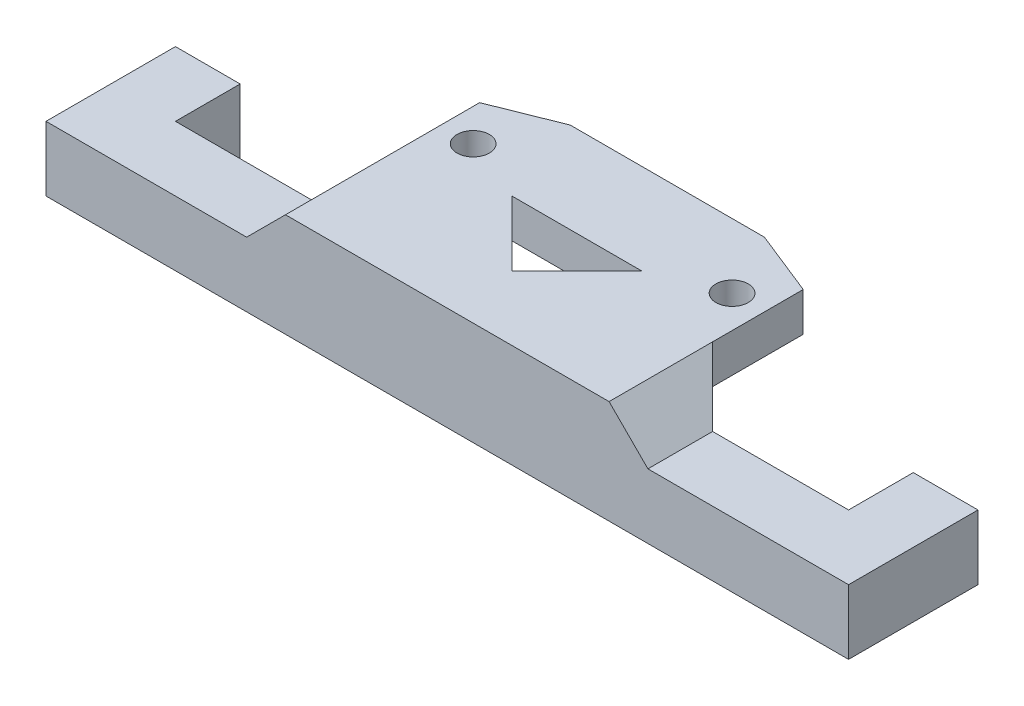
ISO-10303-21;
HEADER;
FILE_DESCRIPTION(('STEP AP214'),'2;1');
FILE_NAME('part.step','',(''),(''),'','','');
FILE_SCHEMA(('AUTOMOTIVE_DESIGN { 1 0 10303 214 1 1 1 1 }'));
ENDSEC;
DATA;
#1=APPLICATION_CONTEXT('core data for automotive mechanical design processes');
#2=APPLICATION_PROTOCOL_DEFINITION('international standard','automotive_design',2000,#1);
#3=PRODUCT_CONTEXT('',#1,'mechanical');
#4=PRODUCT('Part','Part','',(#3));
#5=PRODUCT_RELATED_PRODUCT_CATEGORY('part','',(#4));
#6=PRODUCT_DEFINITION_FORMATION('','',#4);
#7=PRODUCT_DEFINITION_CONTEXT('part definition',#1,'design');
#8=PRODUCT_DEFINITION('design','',#6,#7);
#9=PRODUCT_DEFINITION_SHAPE('','',#8);
#10=(LENGTH_UNIT() NAMED_UNIT(*) SI_UNIT(.MILLI.,.METRE.));
#11=(NAMED_UNIT(*) PLANE_ANGLE_UNIT() SI_UNIT($,.RADIAN.));
#12=(NAMED_UNIT(*) SI_UNIT($,.STERADIAN.) SOLID_ANGLE_UNIT());
#13=UNCERTAINTY_MEASURE_WITH_UNIT(LENGTH_MEASURE(1.E-05),#10,'distance_accuracy_value','');
#14=(GEOMETRIC_REPRESENTATION_CONTEXT(3) GLOBAL_UNCERTAINTY_ASSIGNED_CONTEXT((#13)) GLOBAL_UNIT_ASSIGNED_CONTEXT((#10,
#11,#12)) REPRESENTATION_CONTEXT('',''));
#15=CARTESIAN_POINT('',(0.,0.,0.));
#16=DIRECTION('',(0.,0.,1.));
#17=DIRECTION('',(1.,0.,0.));
#18=AXIS2_PLACEMENT_3D('',#15,#16,#17);
#19=CARTESIAN_POINT('',(0.,5.,0.));
#20=DIRECTION('',(0.,-1.,0.));
#21=DIRECTION('',(0.,0.,-1.));
#22=AXIS2_PLACEMENT_3D('',#19,#20,#21);
#23=PLANE('',#22);
#24=DIRECTION('',(1.,0.,0.));
#25=VECTOR('',#24,1.);
#26=CARTESIAN_POINT('',(32.8888888888889,5.,5.));
#27=LINE('',#26,#25);
#28=CARTESIAN_POINT('',(-29.1111111111111,5.,5.00000000000001));
#29=VERTEX_POINT('',#28);
#30=CARTESIAN_POINT('',(-13.6111111111112,5.,5.00000000000001));
#31=VERTEX_POINT('',#30);
#32=EDGE_CURVE('E217',#29,#31,#27,.T.);
#33=ORIENTED_EDGE('',*,*,#32,.T.);
#34=DIRECTION('',(0.,0.,-1.));
#35=VECTOR('',#34,1.);
#36=CARTESIAN_POINT('',(-13.6111111111112,5.,0.));
#37=LINE('',#36,#35);
#38=CARTESIAN_POINT('',(-13.6111111111112,5.,0.));
#39=VERTEX_POINT('',#38);
#40=EDGE_CURVE('E301',#31,#39,#37,.T.);
#41=ORIENTED_EDGE('',*,*,#40,.T.);
#42=DIRECTION('',(-1.,0.,0.));
#43=VECTOR('',#42,1.);
#44=CARTESIAN_POINT('',(-24.1111111111111,5.,0.));
#45=LINE('',#44,#43);
#46=CARTESIAN_POINT('',(-24.1111111111111,5.,0.));
#47=VERTEX_POINT('',#46);
#48=EDGE_CURVE('E268',#39,#47,#45,.T.);
#49=ORIENTED_EDGE('',*,*,#48,.T.);
#50=DIRECTION('',(0.,0.,-1.));
#51=VECTOR('',#50,1.);
#52=CARTESIAN_POINT('',(-24.1111111111111,5.,-5.));
#53=LINE('',#52,#51);
#54=CARTESIAN_POINT('',(-24.1111111111111,5.,-5.));
#55=VERTEX_POINT('',#54);
#56=EDGE_CURVE('E245',#47,#55,#53,.T.);
#57=ORIENTED_EDGE('',*,*,#56,.T.);
#58=DIRECTION('',(-1.,0.,0.));
#59=VECTOR('',#58,1.);
#60=CARTESIAN_POINT('',(-29.1111111111111,5.,-5.));
#61=LINE('',#60,#59);
#62=CARTESIAN_POINT('',(-29.1111111111111,5.,-5.));
#63=VERTEX_POINT('',#62);
#64=EDGE_CURVE('E202',#55,#63,#61,.T.);
#65=ORIENTED_EDGE('',*,*,#64,.T.);
#66=DIRECTION('',(0.,0.,1.));
#67=VECTOR('',#66,1.);
#68=CARTESIAN_POINT('',(-29.1111111111111,5.,5.00000000000001));
#69=LINE('',#68,#67);
#70=EDGE_CURVE('E205',#63,#29,#69,.T.);
#71=ORIENTED_EDGE('',*,*,#70,.T.);
#72=EDGE_LOOP('',(#33,#41,#49,#57,#65,#71));
#73=FACE_BOUND('',#72,.T.);
#74=ADVANCED_FACE('F35',(#73),#23,.F.);
#75=CARTESIAN_POINT('',(-29.1111111111111,5.,-5.));
#76=DIRECTION('',(0.,0.,1.));
#77=DIRECTION('',(1.,0.,0.));
#78=AXIS2_PLACEMENT_3D('',#75,#76,#77);
#79=PLANE('',#78);
#80=DIRECTION('',(-1.,0.,0.));
#81=VECTOR('',#80,1.);
#82=CARTESIAN_POINT('',(-29.1111111111111,0.,-5.));
#83=LINE('',#82,#81);
#84=CARTESIAN_POINT('',(-24.1111111111111,0.,-5.));
#85=VERTEX_POINT('',#84);
#86=CARTESIAN_POINT('',(-29.1111111111111,0.,-5.));
#87=VERTEX_POINT('',#86);
#88=EDGE_CURVE('E259',#85,#87,#83,.T.);
#89=ORIENTED_EDGE('',*,*,#88,.T.);
#90=DIRECTION('',(0.,-1.,0.));
#91=VECTOR('',#90,1.);
#92=CARTESIAN_POINT('',(-29.1111111111111,5.,-5.));
#93=LINE('',#92,#91);
#94=EDGE_CURVE('E220',#63,#87,#93,.T.);
#95=ORIENTED_EDGE('',*,*,#94,.F.);
#96=ORIENTED_EDGE('',*,*,#64,.F.);
#97=DIRECTION('',(0.,-1.,0.));
#98=VECTOR('',#97,1.);
#99=CARTESIAN_POINT('',(-24.1111111111111,5.,-5.));
#100=LINE('',#99,#98);
#101=EDGE_CURVE('E242',#55,#85,#100,.T.);
#102=ORIENTED_EDGE('',*,*,#101,.T.);
#103=EDGE_LOOP('',(#89,#95,#96,#102));
#104=FACE_BOUND('',#103,.T.);
#105=ADVANCED_FACE('F440',(#104),#79,.F.);
#106=CARTESIAN_POINT('',(-29.1111111111111,5.,5.00000000000001));
#107=DIRECTION('',(1.,0.,0.));
#108=DIRECTION('',(0.,0.,-1.));
#109=AXIS2_PLACEMENT_3D('',#106,#107,#108);
#110=PLANE('',#109);
#111=DIRECTION('',(0.,0.,1.));
#112=VECTOR('',#111,1.);
#113=CARTESIAN_POINT('',(-29.1111111111111,0.,5.00000000000001));
#114=LINE('',#113,#112);
#115=CARTESIAN_POINT('',(-29.1111111111111,0.,5.00000000000001));
#116=VERTEX_POINT('',#115);
#117=EDGE_CURVE('E257',#87,#116,#114,.T.);
#118=ORIENTED_EDGE('',*,*,#117,.T.);
#119=DIRECTION('',(0.,-1.,0.));
#120=VECTOR('',#119,1.);
#121=CARTESIAN_POINT('',(-29.1111111111111,5.,5.00000000000001));
#122=LINE('',#121,#120);
#123=EDGE_CURVE('E224',#29,#116,#122,.T.);
#124=ORIENTED_EDGE('',*,*,#123,.F.);
#125=ORIENTED_EDGE('',*,*,#70,.F.);
#126=ORIENTED_EDGE('',*,*,#94,.T.);
#127=EDGE_LOOP('',(#118,#124,#125,#126));
#128=FACE_BOUND('',#127,.T.);
#129=ADVANCED_FACE('F445',(#128),#110,.F.);
#130=CARTESIAN_POINT('',(32.8888888888889,5.,5.));
#131=DIRECTION('',(0.,0.,-1.));
#132=DIRECTION('',(-1.,0.,0.));
#133=AXIS2_PLACEMENT_3D('',#130,#131,#132);
#134=PLANE('',#133);
#135=DIRECTION('',(1.,0.,0.));
#136=VECTOR('',#135,1.);
#137=CARTESIAN_POINT('',(32.8888888888889,0.,5.));
#138=LINE('',#137,#136);
#139=CARTESIAN_POINT('',(32.8888888888889,0.,5.));
#140=VERTEX_POINT('',#139);
#141=EDGE_CURVE('E255',#116,#140,#138,.T.);
#142=ORIENTED_EDGE('',*,*,#141,.T.);
#143=DIRECTION('',(0.,-1.,0.));
#144=VECTOR('',#143,1.);
#145=CARTESIAN_POINT('',(32.8888888888889,5.,5.));
#146=LINE('',#145,#144);
#147=CARTESIAN_POINT('',(32.8888888888889,5.,5.));
#148=VERTEX_POINT('',#147);
#149=EDGE_CURVE('E227',#148,#140,#146,.T.);
#150=ORIENTED_EDGE('',*,*,#149,.F.);
#151=CARTESIAN_POINT('',(17.3888888888889,5.,5.));
#152=VERTEX_POINT('',#151);
#153=EDGE_CURVE('E208',#152,#148,#27,.T.);
#154=ORIENTED_EDGE('',*,*,#153,.F.);
#155=DIRECTION('',(-0.707106781186552,0.707106781186544,0.));
#156=VECTOR('',#155,1.);
#157=CARTESIAN_POINT('',(25.138888888889,-2.74999999999998,5.));
#158=LINE('',#157,#156);
#159=CARTESIAN_POINT('',(14.3888888888889,8.,5.));
#160=VERTEX_POINT('',#159);
#161=EDGE_CURVE('E300',#152,#160,#158,.T.);
#162=ORIENTED_EDGE('',*,*,#161,.T.);
#163=DIRECTION('',(1.,0.,0.));
#164=VECTOR('',#163,1.);
#165=CARTESIAN_POINT('',(0.,8.,5.));
#166=LINE('',#165,#164);
#167=CARTESIAN_POINT('',(-10.6111111111111,8.,5.));
#168=VERTEX_POINT('',#167);
#169=EDGE_CURVE('E399',#168,#160,#166,.T.);
#170=ORIENTED_EDGE('',*,*,#169,.F.);
#171=DIRECTION('',(-0.707106781186552,-0.707106781186544,0.));
#172=VECTOR('',#171,1.);
#173=CARTESIAN_POINT('',(9.63888888888911,28.25,5.));
#174=LINE('',#173,#172);
#175=EDGE_CURVE('E316',#168,#31,#174,.T.);
#176=ORIENTED_EDGE('',*,*,#175,.T.);
#177=ORIENTED_EDGE('',*,*,#32,.F.);
#178=ORIENTED_EDGE('',*,*,#123,.T.);
#179=EDGE_LOOP('',(#142,#150,#154,#162,#170,#176,#177,#178));
#180=FACE_BOUND('',#179,.T.);
#181=ADVANCED_FACE('F467',(#180),#134,.F.);
#182=CARTESIAN_POINT('',(32.8888888888889,5.,-5.));
#183=DIRECTION('',(-1.,0.,0.));
#184=DIRECTION('',(0.,0.,1.));
#185=AXIS2_PLACEMENT_3D('',#182,#183,#184);
#186=PLANE('',#185);
#187=DIRECTION('',(0.,0.,-1.));
#188=VECTOR('',#187,1.);
#189=CARTESIAN_POINT('',(32.8888888888889,0.,-5.));
#190=LINE('',#189,#188);
#191=CARTESIAN_POINT('',(32.8888888888889,0.,-5.));
#192=VERTEX_POINT('',#191);
#193=EDGE_CURVE('E253',#140,#192,#190,.T.);
#194=ORIENTED_EDGE('',*,*,#193,.T.);
#195=DIRECTION('',(0.,-1.,0.));
#196=VECTOR('',#195,1.);
#197=CARTESIAN_POINT('',(32.8888888888889,5.,-5.));
#198=LINE('',#197,#196);
#199=CARTESIAN_POINT('',(32.8888888888889,5.,-5.));
#200=VERTEX_POINT('',#199);
#201=EDGE_CURVE('E230',#200,#192,#198,.T.);
#202=ORIENTED_EDGE('',*,*,#201,.F.);
#203=DIRECTION('',(0.,0.,-1.));
#204=VECTOR('',#203,1.);
#205=CARTESIAN_POINT('',(32.8888888888889,5.,-5.));
#206=LINE('',#205,#204);
#207=EDGE_CURVE('E211',#148,#200,#206,.T.);
#208=ORIENTED_EDGE('',*,*,#207,.F.);
#209=ORIENTED_EDGE('',*,*,#149,.T.);
#210=EDGE_LOOP('',(#194,#202,#208,#209));
#211=FACE_BOUND('',#210,.T.);
#212=ADVANCED_FACE('F281',(#211),#186,.F.);
#213=CARTESIAN_POINT('',(27.8888888888889,5.,-5.));
#214=DIRECTION('',(0.,0.,1.));
#215=DIRECTION('',(1.,0.,0.));
#216=AXIS2_PLACEMENT_3D('',#213,#214,#215);
#217=PLANE('',#216);
#218=DIRECTION('',(-1.,0.,0.));
#219=VECTOR('',#218,1.);
#220=CARTESIAN_POINT('',(27.8888888888889,0.,-5.));
#221=LINE('',#220,#219);
#222=CARTESIAN_POINT('',(27.8888888888889,0.,-5.));
#223=VERTEX_POINT('',#222);
#224=EDGE_CURVE('E251',#192,#223,#221,.T.);
#225=ORIENTED_EDGE('',*,*,#224,.T.);
#226=DIRECTION('',(0.,-1.,0.));
#227=VECTOR('',#226,1.);
#228=CARTESIAN_POINT('',(27.8888888888889,5.,-5.));
#229=LINE('',#228,#227);
#230=CARTESIAN_POINT('',(27.8888888888889,5.,-5.));
#231=VERTEX_POINT('',#230);
#232=EDGE_CURVE('E233',#231,#223,#229,.T.);
#233=ORIENTED_EDGE('',*,*,#232,.F.);
#234=DIRECTION('',(-1.,0.,0.));
#235=VECTOR('',#234,1.);
#236=CARTESIAN_POINT('',(27.8888888888889,5.,-5.));
#237=LINE('',#236,#235);
#238=EDGE_CURVE('E270',#200,#231,#237,.T.);
#239=ORIENTED_EDGE('',*,*,#238,.F.);
#240=ORIENTED_EDGE('',*,*,#201,.T.);
#241=EDGE_LOOP('',(#225,#233,#239,#240));
#242=FACE_BOUND('',#241,.T.);
#243=ADVANCED_FACE('F285',(#242),#217,.F.);
#244=CARTESIAN_POINT('',(27.8888888888889,5.,0.));
#245=DIRECTION('',(1.,0.,0.));
#246=DIRECTION('',(0.,0.,-1.));
#247=AXIS2_PLACEMENT_3D('',#244,#245,#246);
#248=PLANE('',#247);
#249=DIRECTION('',(0.,0.,1.));
#250=VECTOR('',#249,1.);
#251=CARTESIAN_POINT('',(27.8888888888889,0.,0.));
#252=LINE('',#251,#250);
#253=CARTESIAN_POINT('',(27.8888888888889,0.,0.));
#254=VERTEX_POINT('',#253);
#255=EDGE_CURVE('E249',#223,#254,#252,.T.);
#256=ORIENTED_EDGE('',*,*,#255,.T.);
#257=DIRECTION('',(0.,-1.,0.));
#258=VECTOR('',#257,1.);
#259=CARTESIAN_POINT('',(27.8888888888889,5.,0.));
#260=LINE('',#259,#258);
#261=CARTESIAN_POINT('',(27.8888888888889,5.,0.));
#262=VERTEX_POINT('',#261);
#263=EDGE_CURVE('E236',#262,#254,#260,.T.);
#264=ORIENTED_EDGE('',*,*,#263,.F.);
#265=DIRECTION('',(0.,0.,1.));
#266=VECTOR('',#265,1.);
#267=CARTESIAN_POINT('',(27.8888888888889,5.,0.));
#268=LINE('',#267,#266);
#269=EDGE_CURVE('E269',#231,#262,#268,.T.);
#270=ORIENTED_EDGE('',*,*,#269,.F.);
#271=ORIENTED_EDGE('',*,*,#232,.T.);
#272=EDGE_LOOP('',(#256,#264,#270,#271));
#273=FACE_BOUND('',#272,.T.);
#274=ADVANCED_FACE('F290',(#273),#248,.F.);
#275=CARTESIAN_POINT('',(-24.1111111111111,5.,0.));
#276=DIRECTION('',(0.,0.,1.));
#277=DIRECTION('',(1.,0.,0.));
#278=AXIS2_PLACEMENT_3D('',#275,#276,#277);
#279=PLANE('',#278);
#280=CARTESIAN_POINT('',(17.3888888888889,5.,0.));
#281=VERTEX_POINT('',#280);
#282=CARTESIAN_POINT('',(1.88888888888887,5.,0.));
#283=VERTEX_POINT('',#282);
#284=EDGE_CURVE('E267',#281,#283,#45,.T.);
#285=ORIENTED_EDGE('',*,*,#284,.F.);
#286=EDGE_CURVE('E264',#262,#281,#45,.T.);
#287=ORIENTED_EDGE('',*,*,#286,.F.);
#288=ORIENTED_EDGE('',*,*,#263,.T.);
#289=DIRECTION('',(-1.,0.,0.));
#290=VECTOR('',#289,1.);
#291=CARTESIAN_POINT('',(-24.1111111111111,0.,0.));
#292=LINE('',#291,#290);
#293=CARTESIAN_POINT('',(-24.1111111111111,0.,0.));
#294=VERTEX_POINT('',#293);
#295=EDGE_CURVE('E247',#254,#294,#292,.T.);
#296=ORIENTED_EDGE('',*,*,#295,.T.);
#297=DIRECTION('',(0.,-1.,0.));
#298=VECTOR('',#297,1.);
#299=CARTESIAN_POINT('',(-24.1111111111111,5.,0.));
#300=LINE('',#299,#298);
#301=EDGE_CURVE('E239',#47,#294,#300,.T.);
#302=ORIENTED_EDGE('',*,*,#301,.F.);
#303=ORIENTED_EDGE('',*,*,#48,.F.);
#304=EDGE_CURVE('E329',#283,#39,#45,.T.);
#305=ORIENTED_EDGE('',*,*,#304,.F.);
#306=EDGE_LOOP('',(#285,#287,#288,#296,#302,#303,#305));
#307=FACE_BOUND('',#306,.T.);
#308=ADVANCED_FACE('F328',(#307),#279,.F.);
#309=CARTESIAN_POINT('',(-24.1111111111111,5.,-5.));
#310=DIRECTION('',(-1.,0.,0.));
#311=DIRECTION('',(0.,0.,1.));
#312=AXIS2_PLACEMENT_3D('',#309,#310,#311);
#313=PLANE('',#312);
#314=DIRECTION('',(0.,0.,-1.));
#315=VECTOR('',#314,1.);
#316=CARTESIAN_POINT('',(-24.1111111111111,0.,-5.));
#317=LINE('',#316,#315);
#318=EDGE_CURVE('E206',#294,#85,#317,.T.);
#319=ORIENTED_EDGE('',*,*,#318,.T.);
#320=ORIENTED_EDGE('',*,*,#101,.F.);
#321=ORIENTED_EDGE('',*,*,#56,.F.);
#322=ORIENTED_EDGE('',*,*,#301,.T.);
#323=EDGE_LOOP('',(#319,#320,#321,#322));
#324=FACE_BOUND('',#323,.T.);
#325=ADVANCED_FACE('F450',(#324),#313,.F.);
#326=ORIENTED_EDGE('',*,*,#286,.T.);
#327=DIRECTION('',(0.,0.,1.));
#328=VECTOR('',#327,1.);
#329=CARTESIAN_POINT('',(17.3888888888889,5.,0.));
#330=LINE('',#329,#328);
#331=EDGE_CURVE('E223',#281,#152,#330,.T.);
#332=ORIENTED_EDGE('',*,*,#331,.T.);
#333=ORIENTED_EDGE('',*,*,#153,.T.);
#334=ORIENTED_EDGE('',*,*,#207,.T.);
#335=ORIENTED_EDGE('',*,*,#238,.T.);
#336=ORIENTED_EDGE('',*,*,#269,.T.);
#337=EDGE_LOOP('',(#326,#332,#333,#334,#335,#336));
#338=FACE_BOUND('',#337,.T.);
#339=ADVANCED_FACE('F276',(#338),#23,.F.);
#340=CARTESIAN_POINT('',(0.,0.,0.));
#341=DIRECTION('',(0.,-1.,0.));
#342=DIRECTION('',(0.,0.,-1.));
#343=AXIS2_PLACEMENT_3D('',#340,#341,#342);
#344=PLANE('',#343);
#345=ORIENTED_EDGE('',*,*,#88,.F.);
#346=ORIENTED_EDGE('',*,*,#318,.F.);
#347=ORIENTED_EDGE('',*,*,#295,.F.);
#348=ORIENTED_EDGE('',*,*,#255,.F.);
#349=ORIENTED_EDGE('',*,*,#224,.F.);
#350=ORIENTED_EDGE('',*,*,#193,.F.);
#351=ORIENTED_EDGE('',*,*,#141,.F.);
#352=ORIENTED_EDGE('',*,*,#117,.F.);
#353=EDGE_LOOP('',(#345,#346,#347,#348,#349,#350,#351,#352));
#354=FACE_BOUND('',#353,.T.);
#355=ADVANCED_FACE('F427',(#354),#344,.T.);
#356=CARTESIAN_POINT('',(0.,5.,0.));
#357=DIRECTION('',(0.,1.,0.));
#358=DIRECTION('',(0.,0.,1.));
#359=AXIS2_PLACEMENT_3D('',#356,#357,#358);
#360=PLANE('',#359);
#361=CARTESIAN_POINT('',(11.8888888888889,5.,-7.));
#362=DIRECTION('',(0.,1.,0.));
#363=DIRECTION('',(0.,0.,1.));
#364=AXIS2_PLACEMENT_3D('',#361,#362,#363);
#365=CIRCLE('',#364,1.25);
#366=CARTESIAN_POINT('',(11.8888888888889,5.,-5.75));
#367=VERTEX_POINT('',#366);
#368=EDGE_CURVE('E187',#367,#367,#365,.F.);
#369=ORIENTED_EDGE('',*,*,#368,.F.);
#370=EDGE_LOOP('',(#369));
#371=FACE_BOUND('',#370,.T.);
#372=CARTESIAN_POINT('',(-8.11111111111113,5.,-7.));
#373=DIRECTION('',(0.,1.,0.));
#374=DIRECTION('',(0.,0.,1.));
#375=AXIS2_PLACEMENT_3D('',#372,#373,#374);
#376=CIRCLE('',#375,1.25);
#377=CARTESIAN_POINT('',(-8.11111111111113,5.,-5.75));
#378=VERTEX_POINT('',#377);
#379=EDGE_CURVE('E346',#378,#378,#376,.T.);
#380=ORIENTED_EDGE('',*,*,#379,.T.);
#381=EDGE_LOOP('',(#380));
#382=FACE_BOUND('',#381,.T.);
#383=DIRECTION('',(0.,0.,1.));
#384=VECTOR('',#383,1.);
#385=CARTESIAN_POINT('',(14.3888888888889,5.,0.));
#386=LINE('',#385,#384);
#387=CARTESIAN_POINT('',(14.3888888888889,5.,-10.));
#388=VERTEX_POINT('',#387);
#389=CARTESIAN_POINT('',(14.3888888888889,5.,-3.00000000000005));
#390=VERTEX_POINT('',#389);
#391=EDGE_CURVE('E376',#388,#390,#386,.T.);
#392=ORIENTED_EDGE('',*,*,#391,.T.);
#393=DIRECTION('',(0.707106781186543,0.,0.707106781186552));
#394=VECTOR('',#393,1.);
#395=CARTESIAN_POINT('',(8.69444444444455,5.,-8.69444444444444));
#396=LINE('',#395,#394);
#397=EDGE_CURVE('E305',#390,#281,#396,.T.);
#398=ORIENTED_EDGE('',*,*,#397,.T.);
#399=ORIENTED_EDGE('',*,*,#284,.T.);
#400=DIRECTION('',(-0.707106781186544,0.,0.707106781186551));
#401=VECTOR('',#400,1.);
#402=CARTESIAN_POINT('',(0.944444444444444,5.,0.944444444444434));
#403=LINE('',#402,#401);
#404=CARTESIAN_POINT('',(6.88888888888882,5.,-5.));
#405=VERTEX_POINT('',#404);
#406=EDGE_CURVE('E191',#405,#283,#403,.T.);
#407=ORIENTED_EDGE('',*,*,#406,.F.);
#408=DIRECTION('',(1.,0.,0.));
#409=VECTOR('',#408,1.);
#410=CARTESIAN_POINT('',(0.,5.,-5.));
#411=LINE('',#410,#409);
#412=CARTESIAN_POINT('',(-3.11111111111115,5.,-5.));
#413=VERTEX_POINT('',#412);
#414=EDGE_CURVE('E374',#413,#405,#411,.T.);
#415=ORIENTED_EDGE('',*,*,#414,.F.);
#416=DIRECTION('',(-0.707106781186549,0.,-0.707106781186546));
#417=VECTOR('',#416,1.);
#418=CARTESIAN_POINT('',(0.944444444444429,5.,-0.944444444444434));
#419=LINE('',#418,#417);
#420=EDGE_CURVE('E372',#283,#413,#419,.T.);
#421=ORIENTED_EDGE('',*,*,#420,.F.);
#422=ORIENTED_EDGE('',*,*,#304,.T.);
#423=DIRECTION('',(0.707106781186544,0.,-0.707106781186551));
#424=VECTOR('',#423,1.);
#425=CARTESIAN_POINT('',(-6.80555555555565,5.,-6.80555555555558));
#426=LINE('',#425,#424);
#427=CARTESIAN_POINT('',(-10.6111111111111,5.,-3.00000000000005));
#428=VERTEX_POINT('',#427);
#429=EDGE_CURVE('E11',#39,#428,#426,.T.);
#430=ORIENTED_EDGE('',*,*,#429,.T.);
#431=DIRECTION('',(0.,0.,-1.));
#432=VECTOR('',#431,1.);
#433=CARTESIAN_POINT('',(-10.6111111111111,5.,0.));
#434=LINE('',#433,#432);
#435=CARTESIAN_POINT('',(-10.6111111111111,5.,-9.99999999999999));
#436=VERTEX_POINT('',#435);
#437=EDGE_CURVE('E339',#428,#436,#434,.T.);
#438=ORIENTED_EDGE('',*,*,#437,.T.);
#439=DIRECTION('',(0.928476690885259,0.,-0.371390676354104));
#440=VECTOR('',#439,1.);
#441=CARTESIAN_POINT('',(-4.91187739463602,5.,-12.27969348659));
#442=LINE('',#441,#440);
#443=CARTESIAN_POINT('',(-5.61111111111113,5.,-12.));
#444=VERTEX_POINT('',#443);
#445=EDGE_CURVE('E347',#436,#444,#442,.T.);
#446=ORIENTED_EDGE('',*,*,#445,.T.);
#447=DIRECTION('',(1.,0.,0.));
#448=VECTOR('',#447,1.);
#449=CARTESIAN_POINT('',(0.,5.,-12.));
#450=LINE('',#449,#448);
#451=CARTESIAN_POINT('',(9.38888888888887,5.,-12.));
#452=VERTEX_POINT('',#451);
#453=EDGE_CURVE('E351',#444,#452,#450,.T.);
#454=ORIENTED_EDGE('',*,*,#453,.T.);
#455=DIRECTION('',(0.928476690885259,0.,0.371390676354104));
#456=VECTOR('',#455,1.);
#457=CARTESIAN_POINT('',(5.43295019157087,5.,-13.5823754789272));
#458=LINE('',#457,#456);
#459=EDGE_CURVE('E378',#452,#388,#458,.T.);
#460=ORIENTED_EDGE('',*,*,#459,.T.);
#461=EDGE_LOOP('',(#392,#398,#399,#407,#415,#421,#422,#430,#438,#446,#454,#460));
#462=FACE_BOUND('',#461,.T.);
#463=ADVANCED_FACE('F337',(#371,#382,#462),#360,.F.);
#464=CARTESIAN_POINT('',(14.3888888888889,8.,0.));
#465=DIRECTION('',(1.,0.,0.));
#466=DIRECTION('',(0.,0.,-1.));
#467=AXIS2_PLACEMENT_3D('',#464,#465,#466);
#468=PLANE('',#467);
#469=DIRECTION('',(0.,0.,1.));
#470=VECTOR('',#469,1.);
#471=CARTESIAN_POINT('',(14.3888888888889,8.,0.));
#472=LINE('',#471,#470);
#473=CARTESIAN_POINT('',(14.3888888888889,8.,-10.));
#474=VERTEX_POINT('',#473);
#475=CARTESIAN_POINT('',(14.3888888888889,8.,-3.00000000000005));
#476=VERTEX_POINT('',#475);
#477=EDGE_CURVE('E403',#474,#476,#472,.T.);
#478=ORIENTED_EDGE('',*,*,#477,.T.);
#479=DIRECTION('',(0.,-1.,0.));
#480=VECTOR('',#479,1.);
#481=CARTESIAN_POINT('',(14.3888888888889,8.,-3.00000000000005));
#482=LINE('',#481,#480);
#483=EDGE_CURVE('E307',#476,#390,#482,.T.);
#484=ORIENTED_EDGE('',*,*,#483,.T.);
#485=ORIENTED_EDGE('',*,*,#391,.F.);
#486=DIRECTION('',(0.,-1.,0.));
#487=VECTOR('',#486,1.);
#488=CARTESIAN_POINT('',(14.3888888888889,8.,-10.));
#489=LINE('',#488,#487);
#490=EDGE_CURVE('E262',#474,#388,#489,.T.);
#491=ORIENTED_EDGE('',*,*,#490,.F.);
#492=EDGE_LOOP('',(#478,#484,#485,#491));
#493=FACE_BOUND('',#492,.T.);
#494=ADVANCED_FACE('F395',(#493),#468,.T.);
#495=CARTESIAN_POINT('',(5.43295019157087,8.,-13.5823754789272));
#496=DIRECTION('',(0.371390676354103,0.,-0.928476690885259));
#497=DIRECTION('',(-0.928476690885259,0.,-0.371390676354103));
#498=AXIS2_PLACEMENT_3D('',#495,#496,#497);
#499=PLANE('',#498);
#500=ORIENTED_EDGE('',*,*,#459,.F.);
#501=DIRECTION('',(0.,-1.,0.));
#502=VECTOR('',#501,1.);
#503=CARTESIAN_POINT('',(9.38888888888887,8.,-12.));
#504=LINE('',#503,#502);
#505=CARTESIAN_POINT('',(9.38888888888887,8.,-12.));
#506=VERTEX_POINT('',#505);
#507=EDGE_CURVE('E358',#506,#452,#504,.T.);
#508=ORIENTED_EDGE('',*,*,#507,.F.);
#509=DIRECTION('',(0.928476690885259,0.,0.371390676354104));
#510=VECTOR('',#509,1.);
#511=CARTESIAN_POINT('',(5.43295019157087,8.,-13.5823754789272));
#512=LINE('',#511,#510);
#513=EDGE_CURVE('E393',#506,#474,#512,.T.);
#514=ORIENTED_EDGE('',*,*,#513,.T.);
#515=ORIENTED_EDGE('',*,*,#490,.T.);
#516=EDGE_LOOP('',(#500,#508,#514,#515));
#517=FACE_BOUND('',#516,.T.);
#518=ADVANCED_FACE('F391',(#517),#499,.T.);
#519=CARTESIAN_POINT('',(0.,8.,-12.));
#520=DIRECTION('',(0.,0.,-1.));
#521=DIRECTION('',(-1.,0.,0.));
#522=AXIS2_PLACEMENT_3D('',#519,#520,#521);
#523=PLANE('',#522);
#524=ORIENTED_EDGE('',*,*,#453,.F.);
#525=DIRECTION('',(0.,-1.,0.));
#526=VECTOR('',#525,1.);
#527=CARTESIAN_POINT('',(-5.61111111111113,8.,-12.));
#528=LINE('',#527,#526);
#529=CARTESIAN_POINT('',(-5.61111111111113,8.,-12.));
#530=VERTEX_POINT('',#529);
#531=EDGE_CURVE('E196',#530,#444,#528,.T.);
#532=ORIENTED_EDGE('',*,*,#531,.F.);
#533=DIRECTION('',(1.,0.,0.));
#534=VECTOR('',#533,1.);
#535=CARTESIAN_POINT('',(0.,8.,-12.));
#536=LINE('',#535,#534);
#537=EDGE_CURVE('E387',#530,#506,#536,.T.);
#538=ORIENTED_EDGE('',*,*,#537,.T.);
#539=ORIENTED_EDGE('',*,*,#507,.T.);
#540=EDGE_LOOP('',(#524,#532,#538,#539));
#541=FACE_BOUND('',#540,.T.);
#542=ADVANCED_FACE('F384',(#541),#523,.T.);
#543=CARTESIAN_POINT('',(-4.91187739463602,8.,-12.27969348659));
#544=DIRECTION('',(-0.371390676354104,0.,-0.928476690885259));
#545=DIRECTION('',(-0.928476690885259,0.,0.371390676354104));
#546=AXIS2_PLACEMENT_3D('',#543,#544,#545);
#547=PLANE('',#546);
#548=ORIENTED_EDGE('',*,*,#445,.F.);
#549=DIRECTION('',(0.,-1.,0.));
#550=VECTOR('',#549,1.);
#551=CARTESIAN_POINT('',(-10.6111111111111,8.,-9.99999999999999));
#552=LINE('',#551,#550);
#553=CARTESIAN_POINT('',(-10.6111111111111,8.,-9.99999999999999));
#554=VERTEX_POINT('',#553);
#555=EDGE_CURVE('E193',#554,#436,#552,.T.);
#556=ORIENTED_EDGE('',*,*,#555,.F.);
#557=DIRECTION('',(0.928476690885259,0.,-0.371390676354104));
#558=VECTOR('',#557,1.);
#559=CARTESIAN_POINT('',(-4.91187739463602,8.,-12.27969348659));
#560=LINE('',#559,#558);
#561=EDGE_CURVE('E407',#554,#530,#560,.T.);
#562=ORIENTED_EDGE('',*,*,#561,.T.);
#563=ORIENTED_EDGE('',*,*,#531,.T.);
#564=EDGE_LOOP('',(#548,#556,#562,#563));
#565=FACE_BOUND('',#564,.T.);
#566=ADVANCED_FACE('F413',(#565),#547,.T.);
#567=CARTESIAN_POINT('',(0.944444444444444,8.,0.944444444444434));
#568=DIRECTION('',(0.707106781186551,0.,0.707106781186544));
#569=DIRECTION('',(0.707106781186544,0.,-0.707106781186551));
#570=AXIS2_PLACEMENT_3D('',#567,#568,#569);
#571=PLANE('',#570);
#572=ORIENTED_EDGE('',*,*,#406,.T.);
#573=DIRECTION('',(0.,-1.,0.));
#574=VECTOR('',#573,1.);
#575=CARTESIAN_POINT('',(1.88888888888887,8.,0.));
#576=LINE('',#575,#574);
#577=CARTESIAN_POINT('',(1.88888888888887,8.,0.));
#578=VERTEX_POINT('',#577);
#579=EDGE_CURVE('E173',#578,#283,#576,.T.);
#580=ORIENTED_EDGE('',*,*,#579,.F.);
#581=DIRECTION('',(-0.707106781186544,0.,0.707106781186551));
#582=VECTOR('',#581,1.);
#583=CARTESIAN_POINT('',(0.944444444444444,8.,0.944444444444434));
#584=LINE('',#583,#582);
#585=CARTESIAN_POINT('',(6.88888888888882,8.,-5.));
#586=VERTEX_POINT('',#585);
#587=EDGE_CURVE('E180',#586,#578,#584,.T.);
#588=ORIENTED_EDGE('',*,*,#587,.F.);
#589=DIRECTION('',(0.,-1.,0.));
#590=VECTOR('',#589,1.);
#591=CARTESIAN_POINT('',(6.88888888888882,8.,-5.));
#592=LINE('',#591,#590);
#593=EDGE_CURVE('E198',#586,#405,#592,.T.);
#594=ORIENTED_EDGE('',*,*,#593,.T.);
#595=EDGE_LOOP('',(#572,#580,#588,#594));
#596=FACE_BOUND('',#595,.T.);
#597=ADVANCED_FACE('F189',(#596),#571,.F.);
#598=CARTESIAN_POINT('',(0.944444444444429,8.,-0.944444444444434));
#599=DIRECTION('',(-0.707106781186546,0.,0.707106781186549));
#600=DIRECTION('',(0.707106781186549,0.,0.707106781186546));
#601=AXIS2_PLACEMENT_3D('',#598,#599,#600);
#602=PLANE('',#601);
#603=ORIENTED_EDGE('',*,*,#420,.T.);
#604=DIRECTION('',(0.,-1.,0.));
#605=VECTOR('',#604,1.);
#606=CARTESIAN_POINT('',(-3.11111111111115,8.,-5.));
#607=LINE('',#606,#605);
#608=CARTESIAN_POINT('',(-3.11111111111115,8.,-5.));
#609=VERTEX_POINT('',#608);
#610=EDGE_CURVE('E176',#609,#413,#607,.T.);
#611=ORIENTED_EDGE('',*,*,#610,.F.);
#612=DIRECTION('',(-0.707106781186549,0.,-0.707106781186546));
#613=VECTOR('',#612,1.);
#614=CARTESIAN_POINT('',(0.944444444444429,8.,-0.944444444444434));
#615=LINE('',#614,#613);
#616=EDGE_CURVE('E169',#578,#609,#615,.T.);
#617=ORIENTED_EDGE('',*,*,#616,.F.);
#618=ORIENTED_EDGE('',*,*,#579,.T.);
#619=EDGE_LOOP('',(#603,#611,#617,#618));
#620=FACE_BOUND('',#619,.T.);
#621=ADVANCED_FACE('F171',(#620),#602,.F.);
#622=CARTESIAN_POINT('',(-8.11111111111113,8.,-7.));
#623=DIRECTION('',(0.,-1.,0.));
#624=DIRECTION('',(0.,0.,-1.));
#625=AXIS2_PLACEMENT_3D('',#622,#623,#624);
#626=CYLINDRICAL_SURFACE('',#625,1.25);
#627=CARTESIAN_POINT('',(-8.11111111111113,8.,-7.));
#628=DIRECTION('',(0.,1.,0.));
#629=DIRECTION('',(0.,0.,1.));
#630=AXIS2_PLACEMENT_3D('',#627,#628,#629);
#631=CIRCLE('',#630,1.25);
#632=CARTESIAN_POINT('',(-8.11111111111113,8.,-5.75));
#633=VERTEX_POINT('',#632);
#634=EDGE_CURVE('E362',#633,#633,#631,.T.);
#635=ORIENTED_EDGE('',*,*,#634,.T.);
#636=EDGE_LOOP('',(#635));
#637=FACE_BOUND('',#636,.T.);
#638=ORIENTED_EDGE('',*,*,#379,.F.);
#639=EDGE_LOOP('',(#638));
#640=FACE_BOUND('',#639,.T.);
#641=ADVANCED_FACE('F420',(#637,#640),#626,.F.);
#642=CARTESIAN_POINT('',(-10.6111111111111,8.,0.));
#643=DIRECTION('',(-1.,0.,0.));
#644=DIRECTION('',(0.,0.,1.));
#645=AXIS2_PLACEMENT_3D('',#642,#643,#644);
#646=PLANE('',#645);
#647=ORIENTED_EDGE('',*,*,#437,.F.);
#648=DIRECTION('',(0.,1.,0.));
#649=VECTOR('',#648,1.);
#650=CARTESIAN_POINT('',(-10.6111111111111,8.,-3.00000000000005));
#651=LINE('',#650,#649);
#652=CARTESIAN_POINT('',(-10.6111111111111,8.,-3.00000000000005));
#653=VERTEX_POINT('',#652);
#654=EDGE_CURVE('E310',#428,#653,#651,.T.);
#655=ORIENTED_EDGE('',*,*,#654,.T.);
#656=DIRECTION('',(0.,0.,-1.));
#657=VECTOR('',#656,1.);
#658=CARTESIAN_POINT('',(-10.6111111111111,8.,0.));
#659=LINE('',#658,#657);
#660=EDGE_CURVE('E409',#653,#554,#659,.T.);
#661=ORIENTED_EDGE('',*,*,#660,.T.);
#662=ORIENTED_EDGE('',*,*,#555,.T.);
#663=EDGE_LOOP('',(#647,#655,#661,#662));
#664=FACE_BOUND('',#663,.T.);
#665=ADVANCED_FACE('F342',(#664),#646,.T.);
#666=CARTESIAN_POINT('',(0.,8.,-5.));
#667=DIRECTION('',(0.,0.,-1.));
#668=DIRECTION('',(-1.,0.,0.));
#669=AXIS2_PLACEMENT_3D('',#666,#667,#668);
#670=PLANE('',#669);
#671=ORIENTED_EDGE('',*,*,#414,.T.);
#672=ORIENTED_EDGE('',*,*,#593,.F.);
#673=DIRECTION('',(1.,0.,0.));
#674=VECTOR('',#673,1.);
#675=CARTESIAN_POINT('',(0.,8.,-5.));
#676=LINE('',#675,#674);
#677=EDGE_CURVE('E179',#609,#586,#676,.T.);
#678=ORIENTED_EDGE('',*,*,#677,.F.);
#679=ORIENTED_EDGE('',*,*,#610,.T.);
#680=EDGE_LOOP('',(#671,#672,#678,#679));
#681=FACE_BOUND('',#680,.T.);
#682=ADVANCED_FACE('F398',(#681),#670,.F.);
#683=CARTESIAN_POINT('',(11.8888888888889,8.,-7.));
#684=DIRECTION('',(0.,-1.,0.));
#685=DIRECTION('',(0.,0.,-1.));
#686=AXIS2_PLACEMENT_3D('',#683,#684,#685);
#687=CYLINDRICAL_SURFACE('',#686,1.25);
#688=CARTESIAN_POINT('',(11.8888888888889,8.,-7.));
#689=DIRECTION('',(0.,1.,0.));
#690=DIRECTION('',(0.,0.,1.));
#691=AXIS2_PLACEMENT_3D('',#688,#689,#690);
#692=CIRCLE('',#691,1.25);
#693=CARTESIAN_POINT('',(11.8888888888889,8.,-5.75));
#694=VERTEX_POINT('',#693);
#695=EDGE_CURVE('E360',#694,#694,#692,.F.);
#696=ORIENTED_EDGE('',*,*,#695,.F.);
#697=EDGE_LOOP('',(#696));
#698=FACE_BOUND('',#697,.T.);
#699=ORIENTED_EDGE('',*,*,#368,.T.);
#700=EDGE_LOOP('',(#699));
#701=FACE_BOUND('',#700,.T.);
#702=ADVANCED_FACE('F416',(#698,#701),#687,.F.);
#703=CARTESIAN_POINT('',(0.,8.,0.));
#704=DIRECTION('',(0.,1.,0.));
#705=DIRECTION('',(0.,0.,1.));
#706=AXIS2_PLACEMENT_3D('',#703,#704,#705);
#707=PLANE('',#706);
#708=ORIENTED_EDGE('',*,*,#587,.T.);
#709=ORIENTED_EDGE('',*,*,#616,.T.);
#710=ORIENTED_EDGE('',*,*,#677,.T.);
#711=EDGE_LOOP('',(#708,#709,#710));
#712=FACE_BOUND('',#711,.T.);
#713=ORIENTED_EDGE('',*,*,#169,.T.);
#714=EDGE_CURVE('E50',#476,#160,#472,.T.);
#715=ORIENTED_EDGE('',*,*,#714,.F.);
#716=ORIENTED_EDGE('',*,*,#477,.F.);
#717=ORIENTED_EDGE('',*,*,#513,.F.);
#718=ORIENTED_EDGE('',*,*,#537,.F.);
#719=ORIENTED_EDGE('',*,*,#561,.F.);
#720=ORIENTED_EDGE('',*,*,#660,.F.);
#721=EDGE_CURVE('E367',#168,#653,#659,.T.);
#722=ORIENTED_EDGE('',*,*,#721,.F.);
#723=EDGE_LOOP('',(#713,#715,#716,#717,#718,#719,#720,#722));
#724=FACE_BOUND('',#723,.T.);
#725=ORIENTED_EDGE('',*,*,#634,.F.);
#726=EDGE_LOOP('',(#725));
#727=FACE_BOUND('',#726,.T.);
#728=ORIENTED_EDGE('',*,*,#695,.T.);
#729=EDGE_LOOP('',(#728));
#730=FACE_BOUND('',#729,.T.);
#731=ADVANCED_FACE('F183',(#712,#724,#727,#730),#707,.T.);
#732=CARTESIAN_POINT('',(17.3888888888889,5.,0.));
#733=DIRECTION('',(-0.707106781186544,-0.707106781186552,0.));
#734=DIRECTION('',(0.,0.,1.));
#735=AXIS2_PLACEMENT_3D('',#732,#733,#734);
#736=PLANE('',#735);
#737=ORIENTED_EDGE('',*,*,#331,.F.);
#738=DIRECTION('',(-0.577350269189626,0.577350269189619,-0.577350269189633));
#739=VECTOR('',#738,1.);
#740=CARTESIAN_POINT('',(17.3888888888889,5.,0.));
#741=LINE('',#740,#739);
#742=EDGE_CURVE('E298',#281,#476,#741,.T.);
#743=ORIENTED_EDGE('',*,*,#742,.T.);
#744=ORIENTED_EDGE('',*,*,#714,.T.);
#745=ORIENTED_EDGE('',*,*,#161,.F.);
#746=EDGE_LOOP('',(#737,#743,#744,#745));
#747=FACE_BOUND('',#746,.T.);
#748=ADVANCED_FACE('F297',(#747),#736,.F.);
#749=CARTESIAN_POINT('',(-13.6111111111112,5.,0.));
#750=DIRECTION('',(0.707106781186544,-0.707106781186552,0.));
#751=DIRECTION('',(0.,0.,-1.));
#752=AXIS2_PLACEMENT_3D('',#749,#750,#751);
#753=PLANE('',#752);
#754=ORIENTED_EDGE('',*,*,#175,.F.);
#755=ORIENTED_EDGE('',*,*,#721,.T.);
#756=DIRECTION('',(-0.577350269189626,-0.57735026918962,0.577350269189632));
#757=VECTOR('',#756,1.);
#758=CARTESIAN_POINT('',(-13.6111111111112,5.,0.));
#759=LINE('',#758,#757);
#760=EDGE_CURVE('E44',#653,#39,#759,.T.);
#761=ORIENTED_EDGE('',*,*,#760,.T.);
#762=ORIENTED_EDGE('',*,*,#40,.F.);
#763=EDGE_LOOP('',(#754,#755,#761,#762));
#764=FACE_BOUND('',#763,.T.);
#765=ADVANCED_FACE('F476',(#764),#753,.F.);
#766=CARTESIAN_POINT('',(14.3888888888889,8.,-3.00000000000005));
#767=DIRECTION('',(-0.707106781186552,0.,0.707106781186543));
#768=DIRECTION('',(0.,-1.,0.));
#769=AXIS2_PLACEMENT_3D('',#766,#767,#768);
#770=PLANE('',#769);
#771=ORIENTED_EDGE('',*,*,#483,.F.);
#772=ORIENTED_EDGE('',*,*,#742,.F.);
#773=ORIENTED_EDGE('',*,*,#397,.F.);
#774=EDGE_LOOP('',(#771,#772,#773));
#775=FACE_BOUND('',#774,.T.);
#776=ADVANCED_FACE('F303',(#775),#770,.F.);
#777=CARTESIAN_POINT('',(-10.6111111111111,8.,-3.00000000000005));
#778=DIRECTION('',(0.707106781186551,0.,0.707106781186544));
#779=DIRECTION('',(0.,1.,0.));
#780=AXIS2_PLACEMENT_3D('',#777,#778,#779);
#781=PLANE('',#780);
#782=ORIENTED_EDGE('',*,*,#654,.F.);
#783=ORIENTED_EDGE('',*,*,#429,.F.);
#784=ORIENTED_EDGE('',*,*,#760,.F.);
#785=EDGE_LOOP('',(#782,#783,#784));
#786=FACE_BOUND('',#785,.T.);
#787=ADVANCED_FACE('F37',(#786),#781,.F.);
#788=CLOSED_SHELL('',(#74,#105,#129,#181,#212,#243,#274,#308,#325,#339,#355,#463,#494,#518,#542,
#566,#597,#621,#641,#665,#682,#702,#731,#748,#765,#776,#787));
#789=MANIFOLD_SOLID_BREP('B2',#788);
#790=ADVANCED_BREP_SHAPE_REPRESENTATION('',(#18,#789),#14);
#791=SHAPE_DEFINITION_REPRESENTATION(#9,#790);
ENDSEC;
END-ISO-10303-21;
